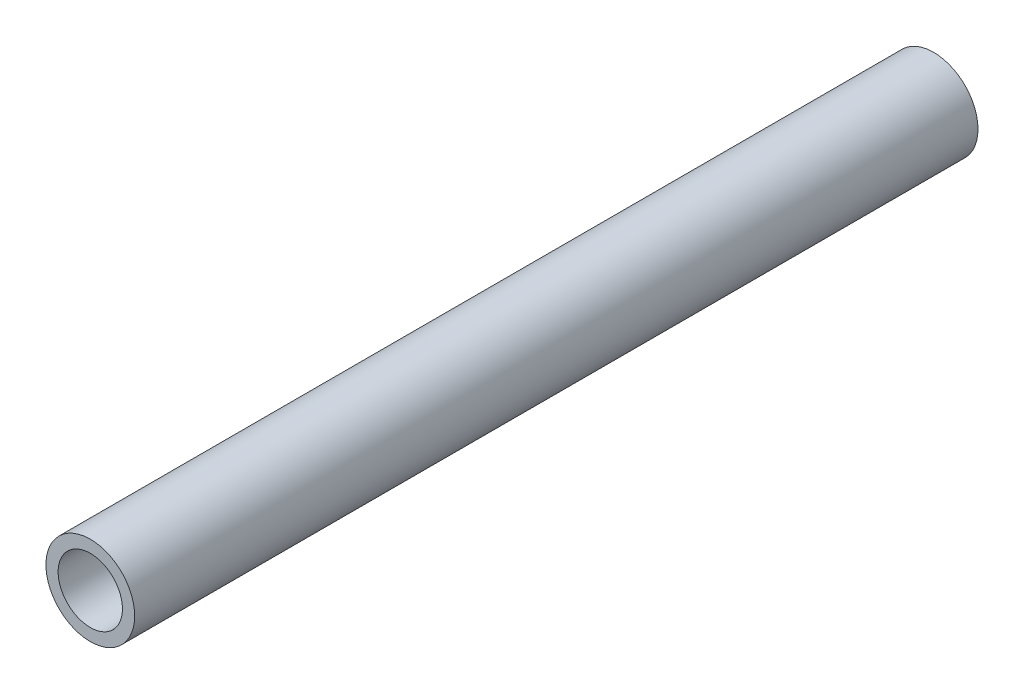
ISO-10303-21;
HEADER;
FILE_DESCRIPTION(('STEP AP214'),'2;1');
FILE_NAME('part.step','',(''),(''),'','','');
FILE_SCHEMA(('AUTOMOTIVE_DESIGN { 1 0 10303 214 1 1 1 1 }'));
ENDSEC;
DATA;
#1=APPLICATION_CONTEXT('core data for automotive mechanical design processes');
#2=APPLICATION_PROTOCOL_DEFINITION('international standard','automotive_design',2000,#1);
#3=PRODUCT_CONTEXT('',#1,'mechanical');
#4=PRODUCT('Part','Part','',(#3));
#5=PRODUCT_RELATED_PRODUCT_CATEGORY('part','',(#4));
#6=PRODUCT_DEFINITION_FORMATION('','',#4);
#7=PRODUCT_DEFINITION_CONTEXT('part definition',#1,'design');
#8=PRODUCT_DEFINITION('design','',#6,#7);
#9=PRODUCT_DEFINITION_SHAPE('','',#8);
#10=(LENGTH_UNIT() NAMED_UNIT(*) SI_UNIT(.MILLI.,.METRE.));
#11=(NAMED_UNIT(*) PLANE_ANGLE_UNIT() SI_UNIT($,.RADIAN.));
#12=(NAMED_UNIT(*) SI_UNIT($,.STERADIAN.) SOLID_ANGLE_UNIT());
#13=UNCERTAINTY_MEASURE_WITH_UNIT(LENGTH_MEASURE(1.E-05),#10,'distance_accuracy_value','');
#14=(GEOMETRIC_REPRESENTATION_CONTEXT(3) GLOBAL_UNCERTAINTY_ASSIGNED_CONTEXT((#13)) GLOBAL_UNIT_ASSIGNED_CONTEXT((#10,
#11,#12)) REPRESENTATION_CONTEXT('',''));
#15=CARTESIAN_POINT('',(0.,0.,0.));
#16=DIRECTION('',(0.,0.,1.));
#17=DIRECTION('',(1.,0.,0.));
#18=AXIS2_PLACEMENT_3D('',#15,#16,#17);
#19=CARTESIAN_POINT('',(0.,0.,203.2));
#20=DIRECTION('',(0.,0.,1.));
#21=DIRECTION('',(1.,0.,0.));
#22=AXIS2_PLACEMENT_3D('',#19,#20,#21);
#23=PLANE('',#22);
#24=CARTESIAN_POINT('',(0.,0.,203.2));
#25=DIRECTION('',(0.,0.,1.));
#26=DIRECTION('',(1.,0.,0.));
#27=AXIS2_PLACEMENT_3D('',#24,#25,#26);
#28=CIRCLE('',#27,10.6934);
#29=CARTESIAN_POINT('',(10.6934,0.,203.2));
#30=VERTEX_POINT('',#29);
#31=EDGE_CURVE('E10',#30,#30,#28,.T.);
#32=ORIENTED_EDGE('',*,*,#31,.T.);
#33=EDGE_LOOP('',(#32));
#34=FACE_BOUND('',#33,.T.);
#35=CARTESIAN_POINT('',(0.,0.,203.2));
#36=DIRECTION('',(0.,0.,1.));
#37=DIRECTION('',(1.,0.,0.));
#38=AXIS2_PLACEMENT_3D('',#35,#36,#37);
#39=CIRCLE('',#38,7.747);
#40=CARTESIAN_POINT('',(7.747,0.,203.2));
#41=VERTEX_POINT('',#40);
#42=EDGE_CURVE('E46',#41,#41,#39,.T.);
#43=ORIENTED_EDGE('',*,*,#42,.F.);
#44=EDGE_LOOP('',(#43));
#45=FACE_BOUND('',#44,.T.);
#46=ADVANCED_FACE('F35',(#34,#45),#23,.T.);
#47=CARTESIAN_POINT('',(0.,0.,0.));
#48=DIRECTION('',(0.,0.,1.));
#49=DIRECTION('',(1.,0.,0.));
#50=AXIS2_PLACEMENT_3D('',#47,#48,#49);
#51=PLANE('',#50);
#52=CARTESIAN_POINT('',(0.,0.,0.));
#53=DIRECTION('',(0.,0.,1.));
#54=DIRECTION('',(1.,0.,0.));
#55=AXIS2_PLACEMENT_3D('',#52,#53,#54);
#56=CIRCLE('',#55,10.6934);
#57=CARTESIAN_POINT('',(10.6934,0.,0.));
#58=VERTEX_POINT('',#57);
#59=EDGE_CURVE('E39',#58,#58,#56,.T.);
#60=ORIENTED_EDGE('',*,*,#59,.F.);
#61=EDGE_LOOP('',(#60));
#62=FACE_BOUND('',#61,.T.);
#63=CARTESIAN_POINT('',(0.,0.,0.));
#64=DIRECTION('',(0.,0.,1.));
#65=DIRECTION('',(1.,0.,0.));
#66=AXIS2_PLACEMENT_3D('',#63,#64,#65);
#67=CIRCLE('',#66,7.747);
#68=CARTESIAN_POINT('',(7.747,0.,0.));
#69=VERTEX_POINT('',#68);
#70=EDGE_CURVE('E48',#69,#69,#67,.T.);
#71=ORIENTED_EDGE('',*,*,#70,.T.);
#72=EDGE_LOOP('',(#71));
#73=FACE_BOUND('',#72,.T.);
#74=ADVANCED_FACE('F58',(#62,#73),#51,.F.);
#75=CARTESIAN_POINT('',(0.,0.,203.2));
#76=DIRECTION('',(0.,0.,-1.));
#77=DIRECTION('',(-1.,0.,0.));
#78=AXIS2_PLACEMENT_3D('',#75,#76,#77);
#79=CYLINDRICAL_SURFACE('',#78,10.6934);
#80=ORIENTED_EDGE('',*,*,#31,.F.);
#81=EDGE_LOOP('',(#80));
#82=FACE_BOUND('',#81,.T.);
#83=ORIENTED_EDGE('',*,*,#59,.T.);
#84=EDGE_LOOP('',(#83));
#85=FACE_BOUND('',#84,.T.);
#86=ADVANCED_FACE('F37',(#82,#85),#79,.T.);
#87=CARTESIAN_POINT('',(0.,0.,203.2));
#88=DIRECTION('',(0.,0.,-1.));
#89=DIRECTION('',(-1.,0.,0.));
#90=AXIS2_PLACEMENT_3D('',#87,#88,#89);
#91=CYLINDRICAL_SURFACE('',#90,7.747);
#92=ORIENTED_EDGE('',*,*,#42,.T.);
#93=EDGE_LOOP('',(#92));
#94=FACE_BOUND('',#93,.T.);
#95=ORIENTED_EDGE('',*,*,#70,.F.);
#96=EDGE_LOOP('',(#95));
#97=FACE_BOUND('',#96,.T.);
#98=ADVANCED_FACE('F54',(#94,#97),#91,.F.);
#99=CLOSED_SHELL('',(#46,#74,#86,#98));
#100=MANIFOLD_SOLID_BREP('B2',#99);
#101=ADVANCED_BREP_SHAPE_REPRESENTATION('',(#18,#100),#14);
#102=SHAPE_DEFINITION_REPRESENTATION(#9,#101);
ENDSEC;
END-ISO-10303-21;
